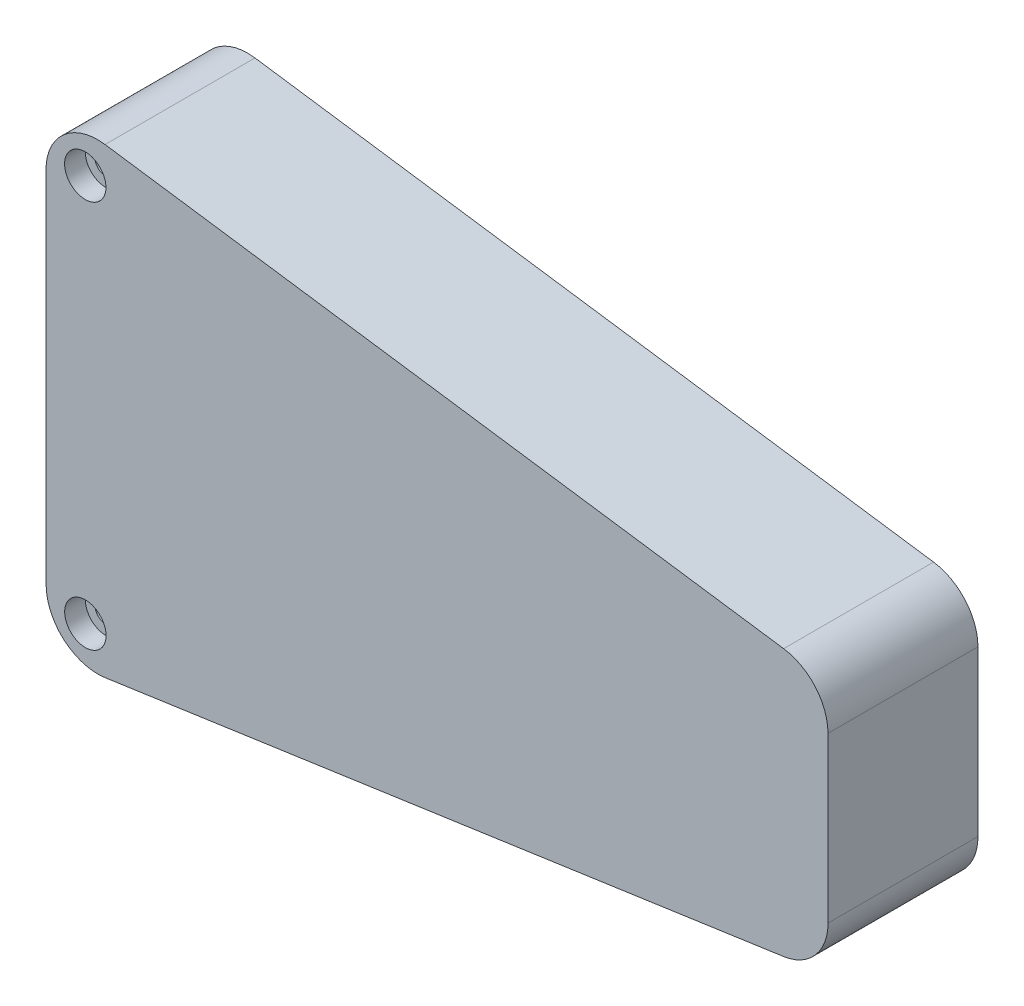
ISO-10303-21;
HEADER;
FILE_DESCRIPTION(('STEP AP214'),'2;1');
FILE_NAME('part.step','',(''),(''),'','','');
FILE_SCHEMA(('AUTOMOTIVE_DESIGN { 1 0 10303 214 1 1 1 1 }'));
ENDSEC;
DATA;
#1=APPLICATION_CONTEXT('core data for automotive mechanical design processes');
#2=APPLICATION_PROTOCOL_DEFINITION('international standard','automotive_design',2000,#1);
#3=PRODUCT_CONTEXT('',#1,'mechanical');
#4=PRODUCT('Part','Part','',(#3));
#5=PRODUCT_RELATED_PRODUCT_CATEGORY('part','',(#4));
#6=PRODUCT_DEFINITION_FORMATION('','',#4);
#7=PRODUCT_DEFINITION_CONTEXT('part definition',#1,'design');
#8=PRODUCT_DEFINITION('design','',#6,#7);
#9=PRODUCT_DEFINITION_SHAPE('','',#8);
#10=(LENGTH_UNIT() NAMED_UNIT(*) SI_UNIT(.MILLI.,.METRE.));
#11=(NAMED_UNIT(*) PLANE_ANGLE_UNIT() SI_UNIT($,.RADIAN.));
#12=(NAMED_UNIT(*) SI_UNIT($,.STERADIAN.) SOLID_ANGLE_UNIT());
#13=UNCERTAINTY_MEASURE_WITH_UNIT(LENGTH_MEASURE(1.E-05),#10,'distance_accuracy_value','');
#14=(GEOMETRIC_REPRESENTATION_CONTEXT(3) GLOBAL_UNCERTAINTY_ASSIGNED_CONTEXT((#13)) GLOBAL_UNIT_ASSIGNED_CONTEXT((#10,
#11,#12)) REPRESENTATION_CONTEXT('',''));
#15=CARTESIAN_POINT('',(0.,0.,0.));
#16=DIRECTION('',(0.,0.,1.));
#17=DIRECTION('',(1.,0.,0.));
#18=AXIS2_PLACEMENT_3D('',#15,#16,#17);
#19=CARTESIAN_POINT('',(244.724765221256,219.42253898846,25.));
#20=DIRECTION('',(-0.999999946667491,-0.00032659610235264,0.));
#21=DIRECTION('',(0.00032659610235264,-0.999999946667492,0.));
#22=AXIS2_PLACEMENT_3D('',#19,#20,#21);
#23=PLANE('',#22);
#24=DIRECTION('',(-0.00032659610235264,0.999999946667492,0.));
#25=VECTOR('',#24,1.);
#26=CARTESIAN_POINT('',(244.724765221256,219.42253898846,25.));
#27=LINE('',#26,#25);
#28=CARTESIAN_POINT('',(244.720279167823,233.158321999003,25.));
#29=VERTEX_POINT('',#28);
#30=CARTESIAN_POINT('',(244.702785952007,286.720549954297,25.));
#31=VERTEX_POINT('',#30);
#32=EDGE_CURVE('E318',#29,#31,#27,.T.);
#33=ORIENTED_EDGE('',*,*,#32,.F.);
#34=DIRECTION('',(0.,0.,-1.));
#35=VECTOR('',#34,1.);
#36=CARTESIAN_POINT('',(244.720279167823,233.158321999003,0.));
#37=LINE('',#36,#35);
#38=CARTESIAN_POINT('',(244.720279167823,233.158321999003,0.));
#39=VERTEX_POINT('',#38);
#40=EDGE_CURVE('E280',#29,#39,#37,.T.);
#41=ORIENTED_EDGE('',*,*,#40,.T.);
#42=DIRECTION('',(-0.00032659610235264,0.999999946667492,0.));
#43=VECTOR('',#42,1.);
#44=CARTESIAN_POINT('',(244.724765221256,219.42253898846,0.));
#45=LINE('',#44,#43);
#46=CARTESIAN_POINT('',(244.702785952007,286.720549954297,0.));
#47=VERTEX_POINT('',#46);
#48=EDGE_CURVE('E301',#39,#47,#45,.T.);
#49=ORIENTED_EDGE('',*,*,#48,.T.);
#50=DIRECTION('',(0.,0.,-1.));
#51=VECTOR('',#50,1.);
#52=CARTESIAN_POINT('',(244.702785952007,286.720549954297,25.));
#53=LINE('',#52,#51);
#54=EDGE_CURVE('E278',#47,#31,#53,.F.);
#55=ORIENTED_EDGE('',*,*,#54,.T.);
#56=EDGE_LOOP('',(#33,#41,#49,#55));
#57=FACE_BOUND('',#56,.T.);
#58=ADVANCED_FACE('F57',(#57),#23,.F.);
#59=CARTESIAN_POINT('',(385.954790061467,239.76732586661,25.));
#60=DIRECTION('',(0.142582448436052,-0.989782928423187,0.));
#61=DIRECTION('',(0.989782928423187,0.142582448436052,0.));
#62=AXIS2_PLACEMENT_3D('',#59,#60,#61);
#63=PLANE('',#62);
#64=DIRECTION('',(-0.989782928423187,-0.142582448436052,0.));
#65=VECTOR('',#64,1.);
#66=CARTESIAN_POINT('',(385.954790061467,239.76732586661,25.));
#67=LINE('',#66,#65);
#68=CARTESIAN_POINT('',(381.666287504258,239.149548799365,25.));
#69=VERTEX_POINT('',#68);
#70=CARTESIAN_POINT('',(258.320209478697,221.38102066574,25.));
#71=VERTEX_POINT('',#70);
#72=EDGE_CURVE('E336',#69,#71,#67,.T.);
#73=ORIENTED_EDGE('',*,*,#72,.F.);
#74=DIRECTION('',(0.,0.,-1.));
#75=VECTOR('',#74,1.);
#76=CARTESIAN_POINT('',(381.666287504258,239.149548799365,0.));
#77=LINE('',#76,#75);
#78=CARTESIAN_POINT('',(381.666287504258,239.149548799365,0.));
#79=VERTEX_POINT('',#78);
#80=EDGE_CURVE('E275',#69,#79,#77,.T.);
#81=ORIENTED_EDGE('',*,*,#80,.T.);
#82=DIRECTION('',(-0.989782928423187,-0.142582448436052,0.));
#83=VECTOR('',#82,1.);
#84=CARTESIAN_POINT('',(385.954790061467,239.76732586661,0.));
#85=LINE('',#84,#83);
#86=CARTESIAN_POINT('',(258.320209478697,221.38102066574,0.));
#87=VERTEX_POINT('',#86);
#88=EDGE_CURVE('E331',#79,#87,#85,.T.);
#89=ORIENTED_EDGE('',*,*,#88,.T.);
#90=DIRECTION('',(0.,0.,-1.));
#91=VECTOR('',#90,1.);
#92=CARTESIAN_POINT('',(258.320209478697,221.38102066574,25.));
#93=LINE('',#92,#91);
#94=EDGE_CURVE('E273',#87,#71,#93,.F.);
#95=ORIENTED_EDGE('',*,*,#94,.T.);
#96=EDGE_LOOP('',(#73,#81,#89,#95));
#97=FACE_BOUND('',#96,.T.);
#98=ADVANCED_FACE('F382',(#97),#63,.F.);
#99=CARTESIAN_POINT('',(244.698299898573,300.45633296484,25.));
#100=DIRECTION('',(0.141935899560218,0.989875851011647,0.));
#101=DIRECTION('',(-0.989875851011647,0.141935899560218,0.));
#102=AXIS2_PLACEMENT_3D('',#99,#100,#101);
#103=PLANE('',#102);
#104=DIRECTION('',(0.989875851011647,-0.141935899560218,0.));
#105=VECTOR('',#104,1.);
#106=CARTESIAN_POINT('',(244.698299898573,300.45633296484,0.));
#107=LINE('',#106,#105);
#108=CARTESIAN_POINT('',(258.295020520594,298.506732143097,0.));
#109=VERTEX_POINT('',#108);
#110=CARTESIAN_POINT('',(381.65267849618,280.818776492384,0.));
#111=VERTEX_POINT('',#110);
#112=EDGE_CURVE('E307',#109,#111,#107,.T.);
#113=ORIENTED_EDGE('',*,*,#112,.T.);
#114=DIRECTION('',(0.,0.,-1.));
#115=VECTOR('',#114,1.);
#116=CARTESIAN_POINT('',(381.65267849618,280.818776492384,25.));
#117=LINE('',#116,#115);
#118=CARTESIAN_POINT('',(381.65267849618,280.818776492384,25.));
#119=VERTEX_POINT('',#118);
#120=EDGE_CURVE('E259',#111,#119,#117,.F.);
#121=ORIENTED_EDGE('',*,*,#120,.T.);
#122=DIRECTION('',(0.989875851011647,-0.141935899560218,0.));
#123=VECTOR('',#122,1.);
#124=CARTESIAN_POINT('',(244.698299898573,300.45633296484,25.));
#125=LINE('',#124,#123);
#126=CARTESIAN_POINT('',(258.295020520594,298.506732143097,25.));
#127=VERTEX_POINT('',#126);
#128=EDGE_CURVE('E330',#127,#119,#125,.T.);
#129=ORIENTED_EDGE('',*,*,#128,.F.);
#130=DIRECTION('',(0.,0.,-1.));
#131=VECTOR('',#130,1.);
#132=CARTESIAN_POINT('',(258.295020520594,298.506732143097,0.));
#133=LINE('',#132,#131);
#134=EDGE_CURVE('E256',#127,#109,#133,.T.);
#135=ORIENTED_EDGE('',*,*,#134,.T.);
#136=EDGE_LOOP('',(#113,#121,#129,#135));
#137=FACE_BOUND('',#136,.T.);
#138=ADVANCED_FACE('F398',(#137),#103,.F.);
#139=CARTESIAN_POINT('',(239.796401926528,0.0783165744042107,25.));
#140=DIRECTION('',(-0.999999946667491,-0.00032659610235264,0.));
#141=DIRECTION('',(0.00032659610235264,-0.999999946667492,0.));
#142=AXIS2_PLACEMENT_3D('',#139,#140,#141);
#143=PLANE('',#142);
#144=DIRECTION('',(-0.00032659610235264,0.999999946667492,0.));
#145=VECTOR('',#144,1.);
#146=CARTESIAN_POINT('',(239.796401926528,0.0783165744042107,0.));
#147=LINE('',#146,#145);
#148=CARTESIAN_POINT('',(239.722881034999,225.19088551963,0.));
#149=VERTEX_POINT('',#148);
#150=CARTESIAN_POINT('',(239.700184618156,294.684720472646,0.));
#151=VERTEX_POINT('',#150);
#152=EDGE_CURVE('E198',#149,#151,#147,.T.);
#153=ORIENTED_EDGE('',*,*,#152,.F.);
#154=DIRECTION('',(0.,0.,-1.));
#155=VECTOR('',#154,1.);
#156=CARTESIAN_POINT('',(239.722881034999,225.19088551963,25.));
#157=LINE('',#156,#155);
#158=CARTESIAN_POINT('',(239.722881034999,225.19088551963,29.));
#159=VERTEX_POINT('',#158);
#160=EDGE_CURVE('E249',#149,#159,#157,.F.);
#161=ORIENTED_EDGE('',*,*,#160,.T.);
#162=DIRECTION('',(0.000326596102352833,-0.999999946667491,0.));
#163=VECTOR('',#162,1.);
#164=CARTESIAN_POINT('',(239.726649940839,213.650926496266,29.));
#165=LINE('',#164,#163);
#166=CARTESIAN_POINT('',(239.700184618156,294.684720472646,29.));
#167=VERTEX_POINT('',#166);
#168=EDGE_CURVE('E698',#167,#159,#165,.T.);
#169=ORIENTED_EDGE('',*,*,#168,.F.);
#170=DIRECTION('',(0.,0.,-1.));
#171=VECTOR('',#170,1.);
#172=CARTESIAN_POINT('',(239.700184618156,294.684720472646,25.));
#173=LINE('',#172,#171);
#174=EDGE_CURVE('E247',#167,#151,#173,.T.);
#175=ORIENTED_EDGE('',*,*,#174,.T.);
#176=EDGE_LOOP('',(#153,#161,#169,#175));
#177=FACE_BOUND('',#176,.T.);
#178=ADVANCED_FACE('F421',(#177),#143,.T.);
#179=CARTESIAN_POINT('',(-25.2780468997974,175.475870696115,25.));
#180=DIRECTION('',(0.142582448436052,-0.989782928423187,0.));
#181=DIRECTION('',(0.989782928423187,0.142582448436052,0.));
#182=AXIS2_PLACEMENT_3D('',#179,#180,#181);
#183=PLANE('',#182);
#184=DIRECTION('',(-0.989782928423188,-0.142582448436052,0.));
#185=VECTOR('',#184,1.);
#186=CARTESIAN_POINT('',(-25.2780468997974,175.475870696115,0.));
#187=LINE('',#186,#185);
#188=CARTESIAN_POINT('',(382.379199746439,234.200634157249,0.));
#189=VERTEX_POINT('',#188);
#190=CARTESIAN_POINT('',(251.148704986035,215.296322196422,0.));
#191=VERTEX_POINT('',#190);
#192=EDGE_CURVE('E218',#189,#191,#187,.T.);
#193=ORIENTED_EDGE('',*,*,#192,.F.);
#194=DIRECTION('',(0.,0.,-1.));
#195=VECTOR('',#194,1.);
#196=CARTESIAN_POINT('',(382.379199746439,234.200634157249,25.));
#197=LINE('',#196,#195);
#198=CARTESIAN_POINT('',(382.379199746439,234.200634157249,29.));
#199=VERTEX_POINT('',#198);
#200=EDGE_CURVE('E245',#189,#199,#197,.F.);
#201=ORIENTED_EDGE('',*,*,#200,.T.);
#202=DIRECTION('',(0.989782928423187,0.142582448436052,0.));
#203=VECTOR('',#202,1.);
#204=CARTESIAN_POINT('',(390.956204860856,235.43618829174,29.));
#205=LINE('',#204,#203);
#206=CARTESIAN_POINT('',(251.148704986035,215.296322196422,29.));
#207=VERTEX_POINT('',#206);
#208=EDGE_CURVE('E364',#207,#199,#205,.T.);
#209=ORIENTED_EDGE('',*,*,#208,.F.);
#210=DIRECTION('',(0.,0.,-1.));
#211=VECTOR('',#210,1.);
#212=CARTESIAN_POINT('',(251.148704986035,215.296322196422,25.));
#213=LINE('',#212,#211);
#214=EDGE_CURVE('E242',#207,#191,#213,.T.);
#215=ORIENTED_EDGE('',*,*,#214,.T.);
#216=EDGE_LOOP('',(#193,#201,#209,#215));
#217=FACE_BOUND('',#216,.T.);
#218=ADVANCED_FACE('F418',(#217),#183,.T.);
#219=CARTESIAN_POINT('',(391.033055696854,0.127709878692758,25.));
#220=DIRECTION('',(0.999999946667491,0.000326596102352727,0.));
#221=DIRECTION('',(-0.000326596102352727,0.999999946667492,0.));
#222=AXIS2_PLACEMENT_3D('',#219,#220,#221);
#223=PLANE('',#222);
#224=DIRECTION('',(0.000326596102352727,-0.999999946667492,0.));
#225=VECTOR('',#224,1.);
#226=CARTESIAN_POINT('',(391.033055696854,0.127709878692758,0.));
#227=LINE('',#226,#225);
#228=CARTESIAN_POINT('',(390.942998465054,275.872663198349,0.));
#229=VERTEX_POINT('',#228);
#230=CARTESIAN_POINT('',(390.953374728753,244.101729402504,0.));
#231=VERTEX_POINT('',#230);
#232=EDGE_CURVE('E213',#229,#231,#227,.T.);
#233=ORIENTED_EDGE('',*,*,#232,.F.);
#234=DIRECTION('',(0.,0.,-1.));
#235=VECTOR('',#234,1.);
#236=CARTESIAN_POINT('',(390.942998465054,275.872663198349,25.));
#237=LINE('',#236,#235);
#238=CARTESIAN_POINT('',(390.942998465054,275.872663198349,29.));
#239=VERTEX_POINT('',#238);
#240=EDGE_CURVE('E233',#229,#239,#237,.F.);
#241=ORIENTED_EDGE('',*,*,#240,.T.);
#242=DIRECTION('',(-0.000326596102351879,0.999999946667492,0.));
#243=VECTOR('',#242,1.);
#244=CARTESIAN_POINT('',(390.940168332951,284.538204309113,29.));
#245=LINE('',#244,#243);
#246=CARTESIAN_POINT('',(390.953374728753,244.101729402504,29.));
#247=VERTEX_POINT('',#246);
#248=EDGE_CURVE('E361',#247,#239,#245,.T.);
#249=ORIENTED_EDGE('',*,*,#248,.F.);
#250=DIRECTION('',(0.,0.,-1.));
#251=VECTOR('',#250,1.);
#252=CARTESIAN_POINT('',(390.953374728753,244.101729402504,25.));
#253=LINE('',#252,#251);
#254=EDGE_CURVE('E230',#247,#231,#253,.T.);
#255=ORIENTED_EDGE('',*,*,#254,.T.);
#256=EDGE_LOOP('',(#233,#241,#249,#255));
#257=FACE_BOUND('',#256,.T.);
#258=ADVANCED_FACE('F351',(#257),#223,.T.);
#259=CARTESIAN_POINT('',(47.853112504409,333.732625858769,25.));
#260=DIRECTION('',(0.141935899560218,0.989875851011647,0.));
#261=DIRECTION('',(-0.989875851011647,0.141935899560218,0.));
#262=AXIS2_PLACEMENT_3D('',#259,#260,#261);
#263=PLANE('',#262);
#264=DIRECTION('',(-0.989875851011647,0.141935899560218,0.));
#265=VECTOR('',#264,1.);
#266=CARTESIAN_POINT('',(239.696415712316,306.22467949601,29.));
#267=LINE('',#266,#265);
#268=CARTESIAN_POINT('',(382.362357993981,285.768155747442,29.));
#269=VERTEX_POINT('',#268);
#270=CARTESIAN_POINT('',(251.119543080433,304.586744943786,29.));
#271=VERTEX_POINT('',#270);
#272=EDGE_CURVE('E360',#269,#271,#267,.T.);
#273=ORIENTED_EDGE('',*,*,#272,.F.);
#274=DIRECTION('',(0.,0.,-1.));
#275=VECTOR('',#274,1.);
#276=CARTESIAN_POINT('',(382.362357993981,285.768155747442,25.));
#277=LINE('',#276,#275);
#278=CARTESIAN_POINT('',(382.362357993981,285.768155747442,0.));
#279=VERTEX_POINT('',#278);
#280=EDGE_CURVE('E204',#269,#279,#277,.T.);
#281=ORIENTED_EDGE('',*,*,#280,.T.);
#282=DIRECTION('',(0.989875851011647,-0.141935899560218,0.));
#283=VECTOR('',#282,1.);
#284=CARTESIAN_POINT('',(47.853112504409,333.732625858769,0.));
#285=LINE('',#284,#283);
#286=CARTESIAN_POINT('',(251.119543080433,304.586744943786,0.));
#287=VERTEX_POINT('',#286);
#288=EDGE_CURVE('E196',#287,#279,#285,.T.);
#289=ORIENTED_EDGE('',*,*,#288,.F.);
#290=DIRECTION('',(0.,0.,-1.));
#291=VECTOR('',#290,1.);
#292=CARTESIAN_POINT('',(251.119543080433,304.586744943786,25.));
#293=LINE('',#292,#291);
#294=EDGE_CURVE('E210',#287,#271,#293,.F.);
#295=ORIENTED_EDGE('',*,*,#294,.T.);
#296=EDGE_LOOP('',(#273,#281,#289,#295));
#297=FACE_BOUND('',#296,.T.);
#298=ADVANCED_FACE('F209',(#297),#263,.T.);
#299=CARTESIAN_POINT('',(0.,0.,0.));
#300=DIRECTION('',(0.,0.,-1.));
#301=DIRECTION('',(-1.,0.,0.));
#302=AXIS2_PLACEMENT_3D('',#299,#300,#301);
#303=PLANE('',#302);
#304=CARTESIAN_POINT('',(247.290055606168,297.458116911915,0.));
#305=DIRECTION('',(0.,0.,1.));
#306=DIRECTION('',(1.,0.,0.));
#307=AXIS2_PLACEMENT_3D('',#304,#305,#306);
#308=CIRCLE('',#307,2.14999999999999);
#309=CARTESIAN_POINT('',(249.440055606168,297.458116911915,0.));
#310=VERTEX_POINT('',#309);
#311=EDGE_CURVE('E683',#310,#310,#308,.T.);
#312=ORIENTED_EDGE('',*,*,#311,.T.);
#313=EDGE_LOOP('',(#312));
#314=FACE_BOUND('',#313,.T.);
#315=CARTESIAN_POINT('',(247.314561964702,222.42244731631,0.));
#316=DIRECTION('',(0.,0.,1.));
#317=DIRECTION('',(1.,0.,0.));
#318=AXIS2_PLACEMENT_3D('',#315,#316,#317);
#319=CIRCLE('',#318,2.14999999999999);
#320=CARTESIAN_POINT('',(249.464561964702,222.42244731631,0.));
#321=VERTEX_POINT('',#320);
#322=EDGE_CURVE('E695',#321,#321,#319,.T.);
#323=ORIENTED_EDGE('',*,*,#322,.T.);
#324=EDGE_LOOP('',(#323));
#325=FACE_BOUND('',#324,.T.);
#326=ORIENTED_EDGE('',*,*,#48,.F.);
#327=CARTESIAN_POINT('',(249.720278901161,233.159954979515,0.));
#328=DIRECTION('',(0.,0.,-1.));
#329=DIRECTION('',(-1.,0.,0.));
#330=AXIS2_PLACEMENT_3D('',#327,#328,#329);
#331=CIRCLE('',#330,5.);
#332=CARTESIAN_POINT('',(246.44710326441,229.380229956318,0.));
#333=VERTEX_POINT('',#332);
#334=EDGE_CURVE('E296',#39,#333,#331,.F.);
#335=ORIENTED_EDGE('',*,*,#334,.T.);
#336=DIRECTION('',(-0.755945004639349,0.654635127350201,0.));
#337=VECTOR('',#336,1.);
#338=CARTESIAN_POINT('',(256.060199966883,221.055456665362,0.));
#339=LINE('',#338,#337);
#340=CARTESIAN_POINT('',(254.334121599765,222.550210284659,0.));
#341=VERTEX_POINT('',#340);
#342=EDGE_CURVE('E326',#341,#333,#339,.T.);
#343=ORIENTED_EDGE('',*,*,#342,.F.);
#344=CARTESIAN_POINT('',(257.607297236517,226.329935307856,0.));
#345=DIRECTION('',(0.,0.,-1.));
#346=DIRECTION('',(-1.,0.,0.));
#347=AXIS2_PLACEMENT_3D('',#344,#345,#346);
#348=CIRCLE('',#347,5.);
#349=EDGE_CURVE('E298',#341,#87,#348,.F.);
#350=ORIENTED_EDGE('',*,*,#349,.T.);
#351=ORIENTED_EDGE('',*,*,#88,.F.);
#352=CARTESIAN_POINT('',(380.953375262078,244.098463441481,0.));
#353=DIRECTION('',(0.,0.,-1.));
#354=DIRECTION('',(-1.,0.,0.));
#355=AXIS2_PLACEMENT_3D('',#352,#353,#354);
#356=CIRCLE('',#355,5.);
#357=CARTESIAN_POINT('',(385.953374995416,244.100096421992,0.));
#358=VERTEX_POINT('',#357);
#359=EDGE_CURVE('E294',#79,#358,#356,.F.);
#360=ORIENTED_EDGE('',*,*,#359,.T.);
#361=DIRECTION('',(0.000326596102352727,-0.999999946667491,0.));
#362=VECTOR('',#361,1.);
#363=CARTESIAN_POINT('',(385.941583665665,280.203800773219,0.));
#364=LINE('',#363,#362);
#365=CARTESIAN_POINT('',(385.942998731716,275.871030217837,0.));
#366=VERTEX_POINT('',#365);
#367=EDGE_CURVE('E341',#366,#358,#364,.T.);
#368=ORIENTED_EDGE('',*,*,#367,.F.);
#369=CARTESIAN_POINT('',(380.942998998379,275.869397237325,0.));
#370=DIRECTION('',(0.,0.,-1.));
#371=DIRECTION('',(-1.,0.,0.));
#372=AXIS2_PLACEMENT_3D('',#369,#370,#371);
#373=CIRCLE('',#372,5.);
#374=EDGE_CURVE('E292',#366,#111,#373,.F.);
#375=ORIENTED_EDGE('',*,*,#374,.T.);
#376=ORIENTED_EDGE('',*,*,#112,.F.);
#377=CARTESIAN_POINT('',(257.585341022792,293.557352888039,0.));
#378=DIRECTION('',(0.,0.,-1.));
#379=DIRECTION('',(-1.,0.,0.));
#380=AXIS2_PLACEMENT_3D('',#377,#378,#379);
#381=CIRCLE('',#380,5.);
#382=CARTESIAN_POINT('',(254.309697197519,297.334939092211,0.));
#383=VERTEX_POINT('',#382);
#384=EDGE_CURVE('E12',#109,#383,#381,.F.);
#385=ORIENTED_EDGE('',*,*,#384,.T.);
#386=DIRECTION('',(0.755517240834273,0.655128765054754,0.));
#387=VECTOR('',#386,1.);
#388=CARTESIAN_POINT('',(256.034798835052,298.830819853506,0.));
#389=LINE('',#388,#387);
#390=CARTESIAN_POINT('',(246.42714186007,290.49976913898,0.));
#391=VERTEX_POINT('',#390);
#392=EDGE_CURVE('E302',#391,#383,#389,.T.);
#393=ORIENTED_EDGE('',*,*,#392,.F.);
#394=CARTESIAN_POINT('',(249.702785685344,286.722182934808,0.));
#395=DIRECTION('',(0.,0.,-1.));
#396=DIRECTION('',(-1.,0.,0.));
#397=AXIS2_PLACEMENT_3D('',#394,#395,#396);
#398=CIRCLE('',#397,5.);
#399=EDGE_CURVE('E65',#391,#47,#398,.F.);
#400=ORIENTED_EDGE('',*,*,#399,.T.);
#401=EDGE_LOOP('',(#326,#335,#343,#350,#351,#360,#368,#375,#376,#385,#393,#400));
#402=FACE_BOUND('',#401,.T.);
#403=ORIENTED_EDGE('',*,*,#288,.T.);
#404=CARTESIAN_POINT('',(380.942998998379,275.869397237326,0.));
#405=DIRECTION('',(0.,0.,-1.));
#406=DIRECTION('',(-1.,0.,0.));
#407=AXIS2_PLACEMENT_3D('',#404,#405,#406);
#408=CIRCLE('',#407,10.);
#409=EDGE_CURVE('E228',#279,#229,#408,.T.);
#410=ORIENTED_EDGE('',*,*,#409,.T.);
#411=ORIENTED_EDGE('',*,*,#232,.T.);
#412=CARTESIAN_POINT('',(380.953375262078,244.098463441481,0.));
#413=DIRECTION('',(0.,0.,-1.));
#414=DIRECTION('',(-1.,0.,0.));
#415=AXIS2_PLACEMENT_3D('',#412,#413,#414);
#416=CIRCLE('',#415,10.);
#417=EDGE_CURVE('E226',#231,#189,#416,.T.);
#418=ORIENTED_EDGE('',*,*,#417,.T.);
#419=ORIENTED_EDGE('',*,*,#192,.T.);
#420=CARTESIAN_POINT('',(249.722880501674,225.194151480654,0.));
#421=DIRECTION('',(0.,0.,-1.));
#422=DIRECTION('',(-1.,0.,0.));
#423=AXIS2_PLACEMENT_3D('',#420,#421,#422);
#424=CIRCLE('',#423,10.);
#425=EDGE_CURVE('E203',#191,#149,#424,.T.);
#426=ORIENTED_EDGE('',*,*,#425,.T.);
#427=ORIENTED_EDGE('',*,*,#152,.T.);
#428=CARTESIAN_POINT('',(249.700184084831,294.687986433669,0.));
#429=DIRECTION('',(0.,0.,-1.));
#430=DIRECTION('',(-1.,0.,0.));
#431=AXIS2_PLACEMENT_3D('',#428,#429,#430);
#432=CIRCLE('',#431,10.);
#433=EDGE_CURVE('E193',#151,#287,#432,.T.);
#434=ORIENTED_EDGE('',*,*,#433,.T.);
#435=EDGE_LOOP('',(#403,#410,#411,#418,#419,#426,#427,#434));
#436=FACE_BOUND('',#435,.T.);
#437=ADVANCED_FACE('F195',(#314,#325,#402,#436),#303,.T.);
#438=CARTESIAN_POINT('',(385.941583665665,280.203800773219,25.));
#439=DIRECTION('',(0.999999946667491,0.000326596102352727,0.));
#440=DIRECTION('',(-0.000326596102352727,0.999999946667492,0.));
#441=AXIS2_PLACEMENT_3D('',#438,#439,#440);
#442=PLANE('',#441);
#443=DIRECTION('',(0.000326596102352727,-0.999999946667491,0.));
#444=VECTOR('',#443,1.);
#445=CARTESIAN_POINT('',(385.941583665665,280.203800773219,25.));
#446=LINE('',#445,#444);
#447=CARTESIAN_POINT('',(385.942998731716,275.871030217837,25.));
#448=VERTEX_POINT('',#447);
#449=CARTESIAN_POINT('',(385.953374995416,244.100096421992,25.));
#450=VERTEX_POINT('',#449);
#451=EDGE_CURVE('E333',#448,#450,#446,.T.);
#452=ORIENTED_EDGE('',*,*,#451,.F.);
#453=DIRECTION('',(0.,0.,-1.));
#454=VECTOR('',#453,1.);
#455=CARTESIAN_POINT('',(385.942998731716,275.871030217837,0.));
#456=LINE('',#455,#454);
#457=EDGE_CURVE('E253',#448,#366,#456,.T.);
#458=ORIENTED_EDGE('',*,*,#457,.T.);
#459=ORIENTED_EDGE('',*,*,#367,.T.);
#460=DIRECTION('',(0.,0.,-1.));
#461=VECTOR('',#460,1.);
#462=CARTESIAN_POINT('',(385.953374995416,244.100096421992,25.));
#463=LINE('',#462,#461);
#464=EDGE_CURVE('E251',#358,#450,#463,.F.);
#465=ORIENTED_EDGE('',*,*,#464,.T.);
#466=EDGE_LOOP('',(#452,#458,#459,#465));
#467=FACE_BOUND('',#466,.T.);
#468=ADVANCED_FACE('F391',(#467),#442,.F.);
#469=CARTESIAN_POINT('',(256.034798835052,298.830819853506,41.1163078364955));
#470=DIRECTION('',(-0.655128765054754,0.755517240834273,0.));
#471=DIRECTION('',(-0.755517240834273,-0.655128765054754,0.));
#472=AXIS2_PLACEMENT_3D('',#469,#470,#471);
#473=PLANE('',#472);
#474=DIRECTION('',(-0.755517240834273,-0.655128765054754,0.));
#475=VECTOR('',#474,1.);
#476=CARTESIAN_POINT('',(256.034798835052,298.830819853506,25.));
#477=LINE('',#476,#475);
#478=CARTESIAN_POINT('',(254.309697197519,297.334939092211,25.));
#479=VERTEX_POINT('',#478);
#480=CARTESIAN_POINT('',(246.42714186007,290.49976913898,25.));
#481=VERTEX_POINT('',#480);
#482=EDGE_CURVE('E308',#479,#481,#477,.T.);
#483=ORIENTED_EDGE('',*,*,#482,.T.);
#484=DIRECTION('',(0.,0.,-1.));
#485=VECTOR('',#484,1.);
#486=CARTESIAN_POINT('',(246.42714186007,290.49976913898,0.));
#487=LINE('',#486,#485);
#488=EDGE_CURVE('E290',#481,#391,#487,.T.);
#489=ORIENTED_EDGE('',*,*,#488,.T.);
#490=ORIENTED_EDGE('',*,*,#392,.T.);
#491=DIRECTION('',(0.,0.,-1.));
#492=VECTOR('',#491,1.);
#493=CARTESIAN_POINT('',(254.309697197519,297.334939092211,25.));
#494=LINE('',#493,#492);
#495=EDGE_CURVE('E288',#383,#479,#494,.F.);
#496=ORIENTED_EDGE('',*,*,#495,.T.);
#497=EDGE_LOOP('',(#483,#489,#490,#496));
#498=FACE_BOUND('',#497,.T.);
#499=ADVANCED_FACE('F320',(#498),#473,.F.);
#500=CARTESIAN_POINT('',(256.060199966883,221.055456665362,41.1163078364955));
#501=DIRECTION('',(-0.654635127350201,-0.755945004639349,0.));
#502=DIRECTION('',(0.755945004639349,-0.654635127350201,0.));
#503=AXIS2_PLACEMENT_3D('',#500,#501,#502);
#504=PLANE('',#503);
#505=ORIENTED_EDGE('',*,*,#342,.T.);
#506=DIRECTION('',(0.,0.,-1.));
#507=VECTOR('',#506,1.);
#508=CARTESIAN_POINT('',(246.44710326441,229.380229956318,25.));
#509=LINE('',#508,#507);
#510=CARTESIAN_POINT('',(246.44710326441,229.380229956318,25.));
#511=VERTEX_POINT('',#510);
#512=EDGE_CURVE('E286',#333,#511,#509,.F.);
#513=ORIENTED_EDGE('',*,*,#512,.T.);
#514=DIRECTION('',(0.75594500463935,-0.654635127350201,0.));
#515=VECTOR('',#514,1.);
#516=CARTESIAN_POINT('',(256.060199966883,221.055456665362,25.));
#517=LINE('',#516,#515);
#518=CARTESIAN_POINT('',(254.334121599765,222.550210284659,25.));
#519=VERTEX_POINT('',#518);
#520=EDGE_CURVE('E323',#511,#519,#517,.T.);
#521=ORIENTED_EDGE('',*,*,#520,.T.);
#522=DIRECTION('',(0.,0.,-1.));
#523=VECTOR('',#522,1.);
#524=CARTESIAN_POINT('',(254.334121599765,222.550210284659,0.));
#525=LINE('',#524,#523);
#526=EDGE_CURVE('E283',#519,#341,#525,.T.);
#527=ORIENTED_EDGE('',*,*,#526,.T.);
#528=EDGE_LOOP('',(#505,#513,#521,#527));
#529=FACE_BOUND('',#528,.T.);
#530=ADVANCED_FACE('F371',(#529),#504,.F.);
#531=CARTESIAN_POINT('',(0.,0.,25.));
#532=DIRECTION('',(0.,0.,-1.));
#533=DIRECTION('',(-1.,0.,0.));
#534=AXIS2_PLACEMENT_3D('',#531,#532,#533);
#535=PLANE('',#534);
#536=ORIENTED_EDGE('',*,*,#128,.T.);
#537=CARTESIAN_POINT('',(380.942998998379,275.869397237325,25.));
#538=DIRECTION('',(0.,0.,-1.));
#539=DIRECTION('',(-1.,0.,0.));
#540=AXIS2_PLACEMENT_3D('',#537,#538,#539);
#541=CIRCLE('',#540,5.);
#542=EDGE_CURVE('E271',#119,#448,#541,.T.);
#543=ORIENTED_EDGE('',*,*,#542,.T.);
#544=ORIENTED_EDGE('',*,*,#451,.T.);
#545=CARTESIAN_POINT('',(380.953375262078,244.098463441481,25.));
#546=DIRECTION('',(0.,0.,-1.));
#547=DIRECTION('',(-1.,0.,0.));
#548=AXIS2_PLACEMENT_3D('',#545,#546,#547);
#549=CIRCLE('',#548,5.);
#550=EDGE_CURVE('E269',#450,#69,#549,.T.);
#551=ORIENTED_EDGE('',*,*,#550,.T.);
#552=ORIENTED_EDGE('',*,*,#72,.T.);
#553=CARTESIAN_POINT('',(257.607297236517,226.329935307856,25.));
#554=DIRECTION('',(0.,0.,-1.));
#555=DIRECTION('',(-1.,0.,0.));
#556=AXIS2_PLACEMENT_3D('',#553,#554,#555);
#557=CIRCLE('',#556,5.);
#558=EDGE_CURVE('E265',#71,#519,#557,.T.);
#559=ORIENTED_EDGE('',*,*,#558,.T.);
#560=ORIENTED_EDGE('',*,*,#520,.F.);
#561=CARTESIAN_POINT('',(249.720278901161,233.159954979515,25.));
#562=DIRECTION('',(0.,0.,-1.));
#563=DIRECTION('',(-1.,0.,0.));
#564=AXIS2_PLACEMENT_3D('',#561,#562,#563);
#565=CIRCLE('',#564,5.);
#566=EDGE_CURVE('E267',#511,#29,#565,.T.);
#567=ORIENTED_EDGE('',*,*,#566,.T.);
#568=ORIENTED_EDGE('',*,*,#32,.T.);
#569=CARTESIAN_POINT('',(249.702785685344,286.722182934808,25.));
#570=DIRECTION('',(0.,0.,-1.));
#571=DIRECTION('',(-1.,0.,0.));
#572=AXIS2_PLACEMENT_3D('',#569,#570,#571);
#573=CIRCLE('',#572,5.);
#574=EDGE_CURVE('E263',#31,#481,#573,.T.);
#575=ORIENTED_EDGE('',*,*,#574,.T.);
#576=ORIENTED_EDGE('',*,*,#482,.F.);
#577=CARTESIAN_POINT('',(257.585341022792,293.557352888039,25.));
#578=DIRECTION('',(0.,0.,-1.));
#579=DIRECTION('',(-1.,0.,0.));
#580=AXIS2_PLACEMENT_3D('',#577,#578,#579);
#581=CIRCLE('',#580,5.);
#582=EDGE_CURVE('E261',#479,#127,#581,.T.);
#583=ORIENTED_EDGE('',*,*,#582,.T.);
#584=EDGE_LOOP('',(#536,#543,#544,#551,#552,#559,#560,#567,#568,#575,#576,#583));
#585=FACE_BOUND('',#584,.T.);
#586=ADVANCED_FACE('F316',(#585),#535,.T.);
#587=CARTESIAN_POINT('',(0.,0.,29.));
#588=DIRECTION('',(0.,0.,-1.));
#589=DIRECTION('',(-1.,0.,0.));
#590=AXIS2_PLACEMENT_3D('',#587,#588,#589);
#591=PLANE('',#590);
#592=CARTESIAN_POINT('',(247.290055606168,297.458116911915,29.));
#593=DIRECTION('',(0.,0.,1.));
#594=DIRECTION('',(1.,0.,0.));
#595=AXIS2_PLACEMENT_3D('',#592,#593,#594);
#596=CIRCLE('',#595,4.);
#597=CARTESIAN_POINT('',(251.290055606168,297.458116911915,29.));
#598=VERTEX_POINT('',#597);
#599=EDGE_CURVE('E677',#598,#598,#596,.T.);
#600=ORIENTED_EDGE('',*,*,#599,.F.);
#601=EDGE_LOOP('',(#600));
#602=FACE_BOUND('',#601,.T.);
#603=CARTESIAN_POINT('',(247.314561964702,222.42244731631,29.));
#604=DIRECTION('',(0.,0.,1.));
#605=DIRECTION('',(1.,0.,0.));
#606=AXIS2_PLACEMENT_3D('',#603,#604,#605);
#607=CIRCLE('',#606,4.);
#608=CARTESIAN_POINT('',(251.314561964702,222.42244731631,29.));
#609=VERTEX_POINT('',#608);
#610=EDGE_CURVE('E680',#609,#609,#607,.T.);
#611=ORIENTED_EDGE('',*,*,#610,.F.);
#612=EDGE_LOOP('',(#611));
#613=FACE_BOUND('',#612,.T.);
#614=ORIENTED_EDGE('',*,*,#248,.T.);
#615=CARTESIAN_POINT('',(380.942998998379,275.869397237326,29.));
#616=DIRECTION('',(0.,0.,-1.));
#617=DIRECTION('',(-1.,0.,0.));
#618=AXIS2_PLACEMENT_3D('',#615,#616,#617);
#619=CIRCLE('',#618,10.);
#620=EDGE_CURVE('E240',#239,#269,#619,.F.);
#621=ORIENTED_EDGE('',*,*,#620,.T.);
#622=ORIENTED_EDGE('',*,*,#272,.T.);
#623=CARTESIAN_POINT('',(249.700184084831,294.687986433669,29.));
#624=DIRECTION('',(0.,0.,-1.));
#625=DIRECTION('',(-1.,0.,0.));
#626=AXIS2_PLACEMENT_3D('',#623,#624,#625);
#627=CIRCLE('',#626,10.);
#628=EDGE_CURVE('E217',#271,#167,#627,.F.);
#629=ORIENTED_EDGE('',*,*,#628,.T.);
#630=ORIENTED_EDGE('',*,*,#168,.T.);
#631=CARTESIAN_POINT('',(249.722880501674,225.194151480654,29.));
#632=DIRECTION('',(0.,0.,-1.));
#633=DIRECTION('',(-1.,0.,0.));
#634=AXIS2_PLACEMENT_3D('',#631,#632,#633);
#635=CIRCLE('',#634,10.);
#636=EDGE_CURVE('E236',#159,#207,#635,.F.);
#637=ORIENTED_EDGE('',*,*,#636,.T.);
#638=ORIENTED_EDGE('',*,*,#208,.T.);
#639=CARTESIAN_POINT('',(380.953375262078,244.098463441481,29.));
#640=DIRECTION('',(0.,0.,-1.));
#641=DIRECTION('',(-1.,0.,0.));
#642=AXIS2_PLACEMENT_3D('',#639,#640,#641);
#643=CIRCLE('',#642,10.);
#644=EDGE_CURVE('E238',#199,#247,#643,.F.);
#645=ORIENTED_EDGE('',*,*,#644,.T.);
#646=EDGE_LOOP('',(#614,#621,#622,#629,#630,#637,#638,#645));
#647=FACE_BOUND('',#646,.T.);
#648=ADVANCED_FACE('F359',(#602,#613,#647),#591,.F.);
#649=CARTESIAN_POINT('',(380.942998998379,275.869397237326,25.));
#650=DIRECTION('',(0.,0.,-1.));
#651=DIRECTION('',(-1.,0.,0.));
#652=AXIS2_PLACEMENT_3D('',#649,#650,#651);
#653=CYLINDRICAL_SURFACE('',#652,10.);
#654=ORIENTED_EDGE('',*,*,#620,.F.);
#655=ORIENTED_EDGE('',*,*,#240,.F.);
#656=ORIENTED_EDGE('',*,*,#409,.F.);
#657=ORIENTED_EDGE('',*,*,#280,.F.);
#658=EDGE_LOOP('',(#654,#655,#656,#657));
#659=FACE_BOUND('',#658,.T.);
#660=ADVANCED_FACE('F357',(#659),#653,.T.);
#661=CARTESIAN_POINT('',(380.953375262078,244.098463441481,25.));
#662=DIRECTION('',(0.,0.,-1.));
#663=DIRECTION('',(-1.,0.,0.));
#664=AXIS2_PLACEMENT_3D('',#661,#662,#663);
#665=CYLINDRICAL_SURFACE('',#664,10.);
#666=ORIENTED_EDGE('',*,*,#644,.F.);
#667=ORIENTED_EDGE('',*,*,#200,.F.);
#668=ORIENTED_EDGE('',*,*,#417,.F.);
#669=ORIENTED_EDGE('',*,*,#254,.F.);
#670=EDGE_LOOP('',(#666,#667,#668,#669));
#671=FACE_BOUND('',#670,.T.);
#672=ADVANCED_FACE('F432',(#671),#665,.T.);
#673=CARTESIAN_POINT('',(249.722880501674,225.194151480654,25.));
#674=DIRECTION('',(0.,0.,-1.));
#675=DIRECTION('',(-1.,0.,0.));
#676=AXIS2_PLACEMENT_3D('',#673,#674,#675);
#677=CYLINDRICAL_SURFACE('',#676,10.);
#678=ORIENTED_EDGE('',*,*,#636,.F.);
#679=ORIENTED_EDGE('',*,*,#160,.F.);
#680=ORIENTED_EDGE('',*,*,#425,.F.);
#681=ORIENTED_EDGE('',*,*,#214,.F.);
#682=EDGE_LOOP('',(#678,#679,#680,#681));
#683=FACE_BOUND('',#682,.T.);
#684=ADVANCED_FACE('F435',(#683),#677,.T.);
#685=CARTESIAN_POINT('',(249.700184084831,294.687986433669,25.));
#686=DIRECTION('',(0.,0.,-1.));
#687=DIRECTION('',(-1.,0.,0.));
#688=AXIS2_PLACEMENT_3D('',#685,#686,#687);
#689=CYLINDRICAL_SURFACE('',#688,10.);
#690=ORIENTED_EDGE('',*,*,#628,.F.);
#691=ORIENTED_EDGE('',*,*,#294,.F.);
#692=ORIENTED_EDGE('',*,*,#433,.F.);
#693=ORIENTED_EDGE('',*,*,#174,.F.);
#694=EDGE_LOOP('',(#690,#691,#692,#693));
#695=FACE_BOUND('',#694,.T.);
#696=ADVANCED_FACE('F216',(#695),#689,.T.);
#697=CARTESIAN_POINT('',(247.314561964702,222.42244731631,29.));
#698=DIRECTION('',(0.,0.,1.));
#699=DIRECTION('',(1.,0.,0.));
#700=AXIS2_PLACEMENT_3D('',#697,#698,#699);
#701=CYLINDRICAL_SURFACE('',#700,2.14999999999999);
#702=ORIENTED_EDGE('',*,*,#322,.F.);
#703=EDGE_LOOP('',(#702));
#704=FACE_BOUND('',#703,.T.);
#705=CARTESIAN_POINT('',(247.314561964702,222.42244731631,25.));
#706=DIRECTION('',(0.,0.,1.));
#707=DIRECTION('',(1.,0.,0.));
#708=AXIS2_PLACEMENT_3D('',#705,#706,#707);
#709=CIRCLE('',#708,2.14999999999999);
#710=CARTESIAN_POINT('',(249.464561964702,222.42244731631,25.));
#711=VERTEX_POINT('',#710);
#712=EDGE_CURVE('E686',#711,#711,#709,.T.);
#713=ORIENTED_EDGE('',*,*,#712,.T.);
#714=EDGE_LOOP('',(#713));
#715=FACE_BOUND('',#714,.T.);
#716=ADVANCED_FACE('F442',(#704,#715),#701,.F.);
#717=CARTESIAN_POINT('',(249.464561964702,222.42244731631,25.));
#718=DIRECTION('',(0.,0.,-1.));
#719=DIRECTION('',(-1.,0.,0.));
#720=AXIS2_PLACEMENT_3D('',#717,#718,#719);
#721=PLANE('',#720);
#722=ORIENTED_EDGE('',*,*,#712,.F.);
#723=EDGE_LOOP('',(#722));
#724=FACE_BOUND('',#723,.T.);
#725=CARTESIAN_POINT('',(247.314561964702,222.42244731631,25.));
#726=DIRECTION('',(0.,0.,1.));
#727=DIRECTION('',(1.,0.,0.));
#728=AXIS2_PLACEMENT_3D('',#725,#726,#727);
#729=CIRCLE('',#728,4.);
#730=CARTESIAN_POINT('',(251.314561964702,222.42244731631,25.));
#731=VERTEX_POINT('',#730);
#732=EDGE_CURVE('E682',#731,#731,#729,.T.);
#733=ORIENTED_EDGE('',*,*,#732,.T.);
#734=EDGE_LOOP('',(#733));
#735=FACE_BOUND('',#734,.T.);
#736=ADVANCED_FACE('F519',(#724,#735),#721,.F.);
#737=CARTESIAN_POINT('',(247.314561964702,222.42244731631,29.));
#738=DIRECTION('',(0.,0.,1.));
#739=DIRECTION('',(1.,0.,0.));
#740=AXIS2_PLACEMENT_3D('',#737,#738,#739);
#741=CYLINDRICAL_SURFACE('',#740,4.);
#742=ORIENTED_EDGE('',*,*,#732,.F.);
#743=EDGE_LOOP('',(#742));
#744=FACE_BOUND('',#743,.T.);
#745=ORIENTED_EDGE('',*,*,#610,.T.);
#746=EDGE_LOOP('',(#745));
#747=FACE_BOUND('',#746,.T.);
#748=ADVANCED_FACE('F510',(#744,#747),#741,.F.);
#749=CARTESIAN_POINT('',(247.290055606168,297.458116911915,29.));
#750=DIRECTION('',(0.,0.,1.));
#751=DIRECTION('',(1.,0.,0.));
#752=AXIS2_PLACEMENT_3D('',#749,#750,#751);
#753=CYLINDRICAL_SURFACE('',#752,2.14999999999999);
#754=ORIENTED_EDGE('',*,*,#311,.F.);
#755=EDGE_LOOP('',(#754));
#756=FACE_BOUND('',#755,.T.);
#757=CARTESIAN_POINT('',(247.290055606168,297.458116911915,25.));
#758=DIRECTION('',(0.,0.,1.));
#759=DIRECTION('',(1.,0.,0.));
#760=AXIS2_PLACEMENT_3D('',#757,#758,#759);
#761=CIRCLE('',#760,2.14999999999999);
#762=CARTESIAN_POINT('',(249.440055606168,297.458116911915,25.));
#763=VERTEX_POINT('',#762);
#764=EDGE_CURVE('E689',#763,#763,#761,.T.);
#765=ORIENTED_EDGE('',*,*,#764,.T.);
#766=EDGE_LOOP('',(#765));
#767=FACE_BOUND('',#766,.T.);
#768=ADVANCED_FACE('F501',(#756,#767),#753,.F.);
#769=CARTESIAN_POINT('',(249.440055606168,297.458116911915,25.));
#770=DIRECTION('',(0.,0.,-1.));
#771=DIRECTION('',(-1.,0.,0.));
#772=AXIS2_PLACEMENT_3D('',#769,#770,#771);
#773=PLANE('',#772);
#774=ORIENTED_EDGE('',*,*,#764,.F.);
#775=EDGE_LOOP('',(#774));
#776=FACE_BOUND('',#775,.T.);
#777=CARTESIAN_POINT('',(247.290055606168,297.458116911915,25.));
#778=DIRECTION('',(0.,0.,1.));
#779=DIRECTION('',(1.,0.,0.));
#780=AXIS2_PLACEMENT_3D('',#777,#778,#779);
#781=CIRCLE('',#780,4.);
#782=CARTESIAN_POINT('',(251.290055606168,297.458116911915,25.));
#783=VERTEX_POINT('',#782);
#784=EDGE_CURVE('E716',#783,#783,#781,.T.);
#785=ORIENTED_EDGE('',*,*,#784,.T.);
#786=EDGE_LOOP('',(#785));
#787=FACE_BOUND('',#786,.T.);
#788=ADVANCED_FACE('F492',(#776,#787),#773,.F.);
#789=CARTESIAN_POINT('',(247.290055606168,297.458116911915,29.));
#790=DIRECTION('',(0.,0.,1.));
#791=DIRECTION('',(1.,0.,0.));
#792=AXIS2_PLACEMENT_3D('',#789,#790,#791);
#793=CYLINDRICAL_SURFACE('',#792,4.);
#794=ORIENTED_EDGE('',*,*,#784,.F.);
#795=EDGE_LOOP('',(#794));
#796=FACE_BOUND('',#795,.T.);
#797=ORIENTED_EDGE('',*,*,#599,.T.);
#798=EDGE_LOOP('',(#797));
#799=FACE_BOUND('',#798,.T.);
#800=ADVANCED_FACE('F445',(#796,#799),#793,.F.);
#801=CARTESIAN_POINT('',(380.942998998379,275.869397237325,25.));
#802=DIRECTION('',(0.,0.,1.));
#803=DIRECTION('',(1.,0.,0.));
#804=AXIS2_PLACEMENT_3D('',#801,#802,#803);
#805=CYLINDRICAL_SURFACE('',#804,5.);
#806=ORIENTED_EDGE('',*,*,#542,.F.);
#807=ORIENTED_EDGE('',*,*,#120,.F.);
#808=ORIENTED_EDGE('',*,*,#374,.F.);
#809=ORIENTED_EDGE('',*,*,#457,.F.);
#810=EDGE_LOOP('',(#806,#807,#808,#809));
#811=FACE_BOUND('',#810,.T.);
#812=ADVANCED_FACE('F395',(#811),#805,.F.);
#813=CARTESIAN_POINT('',(380.953375262078,244.098463441481,25.));
#814=DIRECTION('',(0.,0.,1.));
#815=DIRECTION('',(1.,0.,0.));
#816=AXIS2_PLACEMENT_3D('',#813,#814,#815);
#817=CYLINDRICAL_SURFACE('',#816,5.);
#818=ORIENTED_EDGE('',*,*,#550,.F.);
#819=ORIENTED_EDGE('',*,*,#464,.F.);
#820=ORIENTED_EDGE('',*,*,#359,.F.);
#821=ORIENTED_EDGE('',*,*,#80,.F.);
#822=EDGE_LOOP('',(#818,#819,#820,#821));
#823=FACE_BOUND('',#822,.T.);
#824=ADVANCED_FACE('F386',(#823),#817,.F.);
#825=CARTESIAN_POINT('',(249.720278901161,233.159954979515,25.));
#826=DIRECTION('',(0.,0.,1.));
#827=DIRECTION('',(1.,0.,0.));
#828=AXIS2_PLACEMENT_3D('',#825,#826,#827);
#829=CYLINDRICAL_SURFACE('',#828,5.);
#830=ORIENTED_EDGE('',*,*,#566,.F.);
#831=ORIENTED_EDGE('',*,*,#512,.F.);
#832=ORIENTED_EDGE('',*,*,#334,.F.);
#833=ORIENTED_EDGE('',*,*,#40,.F.);
#834=EDGE_LOOP('',(#830,#831,#832,#833));
#835=FACE_BOUND('',#834,.T.);
#836=ADVANCED_FACE('F448',(#835),#829,.F.);
#837=CARTESIAN_POINT('',(257.607297236517,226.329935307856,41.1163078364955));
#838=DIRECTION('',(0.,0.,1.));
#839=DIRECTION('',(1.,0.,0.));
#840=AXIS2_PLACEMENT_3D('',#837,#838,#839);
#841=CYLINDRICAL_SURFACE('',#840,5.);
#842=ORIENTED_EDGE('',*,*,#558,.F.);
#843=ORIENTED_EDGE('',*,*,#94,.F.);
#844=ORIENTED_EDGE('',*,*,#349,.F.);
#845=ORIENTED_EDGE('',*,*,#526,.F.);
#846=EDGE_LOOP('',(#842,#843,#844,#845));
#847=FACE_BOUND('',#846,.T.);
#848=ADVANCED_FACE('F377',(#847),#841,.F.);
#849=CARTESIAN_POINT('',(249.702785685344,286.722182934808,41.1163078364955));
#850=DIRECTION('',(0.,0.,1.));
#851=DIRECTION('',(1.,0.,0.));
#852=AXIS2_PLACEMENT_3D('',#849,#850,#851);
#853=CYLINDRICAL_SURFACE('',#852,5.);
#854=ORIENTED_EDGE('',*,*,#574,.F.);
#855=ORIENTED_EDGE('',*,*,#54,.F.);
#856=ORIENTED_EDGE('',*,*,#399,.F.);
#857=ORIENTED_EDGE('',*,*,#488,.F.);
#858=EDGE_LOOP('',(#854,#855,#856,#857));
#859=FACE_BOUND('',#858,.T.);
#860=ADVANCED_FACE('F311',(#859),#853,.F.);
#861=CARTESIAN_POINT('',(257.585341022792,293.557352888039,25.));
#862=DIRECTION('',(0.,0.,1.));
#863=DIRECTION('',(1.,0.,0.));
#864=AXIS2_PLACEMENT_3D('',#861,#862,#863);
#865=CYLINDRICAL_SURFACE('',#864,5.);
#866=ORIENTED_EDGE('',*,*,#582,.F.);
#867=ORIENTED_EDGE('',*,*,#495,.F.);
#868=ORIENTED_EDGE('',*,*,#384,.F.);
#869=ORIENTED_EDGE('',*,*,#134,.F.);
#870=EDGE_LOOP('',(#866,#867,#868,#869));
#871=FACE_BOUND('',#870,.T.);
#872=ADVANCED_FACE('F59',(#871),#865,.F.);
#873=CLOSED_SHELL('',(#58,#98,#138,#178,#218,#258,#298,#437,#468,#499,#530,#586,#648,#660,#672,
#684,#696,#716,#736,#748,#768,#788,#800,#812,#824,#836,#848,#860,#872));
#874=MANIFOLD_SOLID_BREP('B2',#873);
#875=ADVANCED_BREP_SHAPE_REPRESENTATION('',(#18,#874),#14);
#876=SHAPE_DEFINITION_REPRESENTATION(#9,#875);
ENDSEC;
END-ISO-10303-21;
